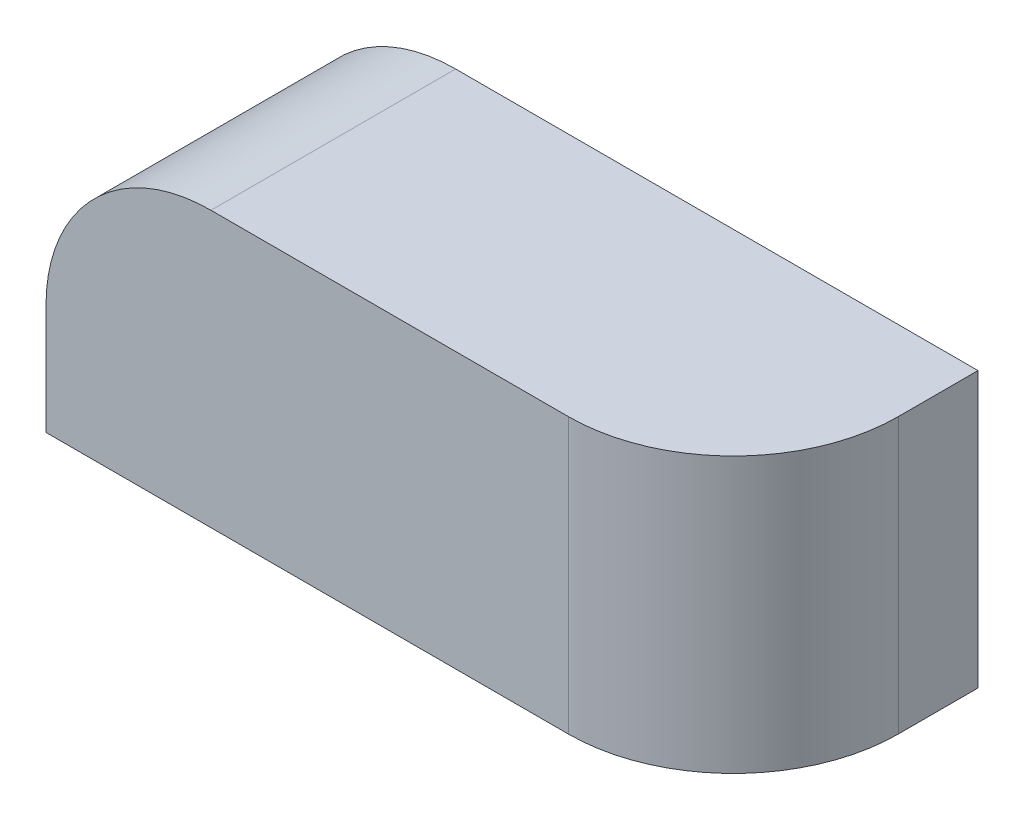
ISO-10303-21;
HEADER;
FILE_DESCRIPTION(('STEP AP214'),'2;1');
FILE_NAME('part.step','',(''),(''),'','','');
FILE_SCHEMA(('AUTOMOTIVE_DESIGN { 1 0 10303 214 1 1 1 1 }'));
ENDSEC;
DATA;
#1=APPLICATION_CONTEXT('core data for automotive mechanical design processes');
#2=APPLICATION_PROTOCOL_DEFINITION('international standard','automotive_design',2000,#1);
#3=PRODUCT_CONTEXT('',#1,'mechanical');
#4=PRODUCT('Part','Part','',(#3));
#5=PRODUCT_RELATED_PRODUCT_CATEGORY('part','',(#4));
#6=PRODUCT_DEFINITION_FORMATION('','',#4);
#7=PRODUCT_DEFINITION_CONTEXT('part definition',#1,'design');
#8=PRODUCT_DEFINITION('design','',#6,#7);
#9=PRODUCT_DEFINITION_SHAPE('','',#8);
#10=(LENGTH_UNIT() NAMED_UNIT(*) SI_UNIT(.MILLI.,.METRE.));
#11=(NAMED_UNIT(*) PLANE_ANGLE_UNIT() SI_UNIT($,.RADIAN.));
#12=(NAMED_UNIT(*) SI_UNIT($,.STERADIAN.) SOLID_ANGLE_UNIT());
#13=UNCERTAINTY_MEASURE_WITH_UNIT(LENGTH_MEASURE(1.E-05),#10,'distance_accuracy_value','');
#14=(GEOMETRIC_REPRESENTATION_CONTEXT(3) GLOBAL_UNCERTAINTY_ASSIGNED_CONTEXT((#13)) GLOBAL_UNIT_ASSIGNED_CONTEXT((#10,
#11,#12)) REPRESENTATION_CONTEXT('',''));
#15=CARTESIAN_POINT('',(0.,0.,0.));
#16=DIRECTION('',(0.,0.,1.));
#17=DIRECTION('',(1.,0.,0.));
#18=AXIS2_PLACEMENT_3D('',#15,#16,#17);
#19=CARTESIAN_POINT('',(-31.4285714285714,11.5037593984962,-89.));
#20=DIRECTION('',(0.,0.,-1.));
#21=DIRECTION('',(-1.,0.,0.));
#22=AXIS2_PLACEMENT_3D('',#19,#20,#21);
#23=PLANE('',#22);
#24=DIRECTION('',(1.,0.,0.));
#25=VECTOR('',#24,1.);
#26=CARTESIAN_POINT('',(158.571428571429,-28.4962406015038,-89.));
#27=LINE('',#26,#25);
#28=CARTESIAN_POINT('',(-91.4285714285714,-28.4962406015038,-89.));
#29=VERTEX_POINT('',#28);
#30=CARTESIAN_POINT('',(158.571428571429,-28.4962406015038,-89.));
#31=VERTEX_POINT('',#30);
#32=EDGE_CURVE('E147',#29,#31,#27,.T.);
#33=ORIENTED_EDGE('',*,*,#32,.F.);
#34=DIRECTION('',(0.,-1.,0.));
#35=VECTOR('',#34,1.);
#36=CARTESIAN_POINT('',(-91.4285714285714,-28.4962406015038,-89.));
#37=LINE('',#36,#35);
#38=CARTESIAN_POINT('',(-91.4285714285714,11.5037593984962,-89.));
#39=VERTEX_POINT('',#38);
#40=EDGE_CURVE('E133',#39,#29,#37,.T.);
#41=ORIENTED_EDGE('',*,*,#40,.F.);
#42=CARTESIAN_POINT('',(-31.4285714285714,11.5037593984962,-89.));
#43=DIRECTION('',(0.,0.,1.));
#44=DIRECTION('',(-1.,0.,0.));
#45=AXIS2_PLACEMENT_3D('',#42,#43,#44);
#46=CIRCLE('',#45,60.);
#47=CARTESIAN_POINT('',(-31.4285714285714,71.5037593984962,-89.));
#48=VERTEX_POINT('',#47);
#49=EDGE_CURVE('E161',#48,#39,#46,.T.);
#50=ORIENTED_EDGE('',*,*,#49,.F.);
#51=DIRECTION('',(-1.,0.,0.));
#52=VECTOR('',#51,1.);
#53=CARTESIAN_POINT('',(-31.4285714285714,71.5037593984962,-89.));
#54=LINE('',#53,#52);
#55=CARTESIAN_POINT('',(158.571428571429,71.5037593984962,-89.));
#56=VERTEX_POINT('',#55);
#57=EDGE_CURVE('E163',#56,#48,#54,.T.);
#58=ORIENTED_EDGE('',*,*,#57,.F.);
#59=DIRECTION('',(0.,1.,0.));
#60=VECTOR('',#59,1.);
#61=CARTESIAN_POINT('',(158.571428571429,71.5037593984962,-89.));
#62=LINE('',#61,#60);
#63=EDGE_CURVE('E149',#31,#56,#62,.T.);
#64=ORIENTED_EDGE('',*,*,#63,.F.);
#65=EDGE_LOOP('',(#33,#41,#50,#58,#64));
#66=FACE_BOUND('',#65,.T.);
#67=DIRECTION('',(0.,-1.,0.));
#68=VECTOR('',#67,1.);
#69=CARTESIAN_POINT('',(-88.2285714285714,-28.4962406015038,-89.));
#70=LINE('',#69,#68);
#71=CARTESIAN_POINT('',(-88.2285714285714,11.5037593984962,-89.));
#72=VERTEX_POINT('',#71);
#73=CARTESIAN_POINT('',(-88.2285714285714,-25.2962406015038,-89.));
#74=VERTEX_POINT('',#73);
#75=EDGE_CURVE('E222',#72,#74,#70,.T.);
#76=ORIENTED_EDGE('',*,*,#75,.T.);
#77=DIRECTION('',(1.,0.,0.));
#78=VECTOR('',#77,1.);
#79=CARTESIAN_POINT('',(158.571428571429,-25.2962406015038,-89.));
#80=LINE('',#79,#78);
#81=CARTESIAN_POINT('',(155.371428571429,-25.2962406015038,-89.));
#82=VERTEX_POINT('',#81);
#83=EDGE_CURVE('E217',#74,#82,#80,.T.);
#84=ORIENTED_EDGE('',*,*,#83,.T.);
#85=DIRECTION('',(0.,1.,0.));
#86=VECTOR('',#85,1.);
#87=CARTESIAN_POINT('',(155.371428571429,71.5037593984962,-89.));
#88=LINE('',#87,#86);
#89=CARTESIAN_POINT('',(155.371428571429,68.3037593984962,-89.));
#90=VERTEX_POINT('',#89);
#91=EDGE_CURVE('E214',#82,#90,#88,.T.);
#92=ORIENTED_EDGE('',*,*,#91,.T.);
#93=DIRECTION('',(-1.,0.,0.));
#94=VECTOR('',#93,1.);
#95=CARTESIAN_POINT('',(-31.4285714285714,68.3037593984962,-89.));
#96=LINE('',#95,#94);
#97=CARTESIAN_POINT('',(-31.4285714285714,68.3037593984962,-89.));
#98=VERTEX_POINT('',#97);
#99=EDGE_CURVE('E52',#90,#98,#96,.T.);
#100=ORIENTED_EDGE('',*,*,#99,.T.);
#101=CARTESIAN_POINT('',(-31.4285714285714,11.5037593984962,-89.));
#102=DIRECTION('',(0.,0.,-1.));
#103=DIRECTION('',(-1.,0.,0.));
#104=AXIS2_PLACEMENT_3D('',#101,#102,#103);
#105=CIRCLE('',#104,56.8);
#106=EDGE_CURVE('E219',#98,#72,#105,.F.);
#107=ORIENTED_EDGE('',*,*,#106,.T.);
#108=EDGE_LOOP('',(#76,#84,#92,#100,#107));
#109=FACE_BOUND('',#108,.T.);
#110=ADVANCED_FACE('F35',(#66,#109),#23,.T.);
#111=CARTESIAN_POINT('',(158.571428571429,-28.4962406015038,-89.));
#112=DIRECTION('',(0.,-1.,0.));
#113=DIRECTION('',(1.,0.,0.));
#114=AXIS2_PLACEMENT_3D('',#111,#112,#113);
#115=PLANE('',#114);
#116=DIRECTION('',(0.,0.,1.));
#117=VECTOR('',#116,1.);
#118=CARTESIAN_POINT('',(158.571428571429,-28.4962406015038,-89.));
#119=LINE('',#118,#117);
#120=CARTESIAN_POINT('',(158.571428571429,-28.4962406015038,-60.));
#121=VERTEX_POINT('',#120);
#122=EDGE_CURVE('E160',#31,#121,#119,.T.);
#123=ORIENTED_EDGE('',*,*,#122,.T.);
#124=CARTESIAN_POINT('',(98.5714285714286,-28.4962406015038,-60.));
#125=DIRECTION('',(0.,1.,0.));
#126=DIRECTION('',(0.,0.,1.));
#127=AXIS2_PLACEMENT_3D('',#124,#125,#126);
#128=CIRCLE('',#127,60.);
#129=CARTESIAN_POINT('',(98.5714285714286,-28.4962406015038,0.));
#130=VERTEX_POINT('',#129);
#131=EDGE_CURVE('E141',#130,#121,#128,.T.);
#132=ORIENTED_EDGE('',*,*,#131,.F.);
#133=DIRECTION('',(1.,0.,0.));
#134=VECTOR('',#133,1.);
#135=CARTESIAN_POINT('',(158.571428571429,-28.4962406015038,0.));
#136=LINE('',#135,#134);
#137=CARTESIAN_POINT('',(-91.4285714285714,-28.4962406015038,0.));
#138=VERTEX_POINT('',#137);
#139=EDGE_CURVE('E139',#138,#130,#136,.T.);
#140=ORIENTED_EDGE('',*,*,#139,.F.);
#141=DIRECTION('',(0.,0.,1.));
#142=VECTOR('',#141,1.);
#143=CARTESIAN_POINT('',(-91.4285714285714,-28.4962406015038,-89.));
#144=LINE('',#143,#142);
#145=EDGE_CURVE('E12',#29,#138,#144,.T.);
#146=ORIENTED_EDGE('',*,*,#145,.F.);
#147=ORIENTED_EDGE('',*,*,#32,.T.);
#148=EDGE_LOOP('',(#123,#132,#140,#146,#147));
#149=FACE_BOUND('',#148,.T.);
#150=ADVANCED_FACE('F37',(#149),#115,.T.);
#151=CARTESIAN_POINT('',(-31.4285714285714,71.5037593984962,-89.));
#152=DIRECTION('',(0.,1.,0.));
#153=DIRECTION('',(-1.,0.,0.));
#154=AXIS2_PLACEMENT_3D('',#151,#152,#153);
#155=PLANE('',#154);
#156=DIRECTION('',(-1.,0.,0.));
#157=VECTOR('',#156,1.);
#158=CARTESIAN_POINT('',(-31.4285714285714,71.5037593984962,0.));
#159=LINE('',#158,#157);
#160=CARTESIAN_POINT('',(98.5714285714286,71.5037593984962,0.));
#161=VERTEX_POINT('',#160);
#162=CARTESIAN_POINT('',(-31.4285714285714,71.5037593984962,0.));
#163=VERTEX_POINT('',#162);
#164=EDGE_CURVE('E143',#161,#163,#159,.T.);
#165=ORIENTED_EDGE('',*,*,#164,.F.);
#166=CARTESIAN_POINT('',(98.5714285714286,71.5037593984962,-60.));
#167=DIRECTION('',(0.,1.,0.));
#168=DIRECTION('',(0.,0.,1.));
#169=AXIS2_PLACEMENT_3D('',#166,#167,#168);
#170=CIRCLE('',#169,60.);
#171=CARTESIAN_POINT('',(158.571428571429,71.5037593984962,-60.));
#172=VERTEX_POINT('',#171);
#173=EDGE_CURVE('E39',#161,#172,#170,.T.);
#174=ORIENTED_EDGE('',*,*,#173,.T.);
#175=DIRECTION('',(0.,0.,1.));
#176=VECTOR('',#175,1.);
#177=CARTESIAN_POINT('',(158.571428571429,71.5037593984962,-89.));
#178=LINE('',#177,#176);
#179=EDGE_CURVE('E158',#56,#172,#178,.T.);
#180=ORIENTED_EDGE('',*,*,#179,.F.);
#181=ORIENTED_EDGE('',*,*,#57,.T.);
#182=DIRECTION('',(0.,0.,1.));
#183=VECTOR('',#182,1.);
#184=CARTESIAN_POINT('',(-31.4285714285714,71.5037593984962,-89.));
#185=LINE('',#184,#183);
#186=EDGE_CURVE('E155',#48,#163,#185,.T.);
#187=ORIENTED_EDGE('',*,*,#186,.T.);
#188=EDGE_LOOP('',(#165,#174,#180,#181,#187));
#189=FACE_BOUND('',#188,.T.);
#190=ADVANCED_FACE('F170',(#189),#155,.T.);
#191=CARTESIAN_POINT('',(-91.4285714285714,-28.4962406015038,-89.));
#192=DIRECTION('',(-1.,0.,0.));
#193=DIRECTION('',(0.,-1.,0.));
#194=AXIS2_PLACEMENT_3D('',#191,#192,#193);
#195=PLANE('',#194);
#196=DIRECTION('',(0.,-1.,0.));
#197=VECTOR('',#196,1.);
#198=CARTESIAN_POINT('',(-91.4285714285714,-28.4962406015038,0.));
#199=LINE('',#198,#197);
#200=CARTESIAN_POINT('',(-91.4285714285714,11.5037593984962,0.));
#201=VERTEX_POINT('',#200);
#202=EDGE_CURVE('E131',#201,#138,#199,.T.);
#203=ORIENTED_EDGE('',*,*,#202,.F.);
#204=DIRECTION('',(0.,0.,1.));
#205=VECTOR('',#204,1.);
#206=CARTESIAN_POINT('',(-91.4285714285714,11.5037593984962,-89.));
#207=LINE('',#206,#205);
#208=EDGE_CURVE('E44',#39,#201,#207,.T.);
#209=ORIENTED_EDGE('',*,*,#208,.F.);
#210=ORIENTED_EDGE('',*,*,#40,.T.);
#211=ORIENTED_EDGE('',*,*,#145,.T.);
#212=EDGE_LOOP('',(#203,#209,#210,#211));
#213=FACE_BOUND('',#212,.T.);
#214=ADVANCED_FACE('F129',(#213),#195,.T.);
#215=CARTESIAN_POINT('',(-31.4285714285714,11.5037593984962,-89.));
#216=DIRECTION('',(0.,0.,1.));
#217=DIRECTION('',(1.,0.,0.));
#218=AXIS2_PLACEMENT_3D('',#215,#216,#217);
#219=CYLINDRICAL_SURFACE('',#218,60.);
#220=CARTESIAN_POINT('',(-31.4285714285714,11.5037593984962,0.));
#221=DIRECTION('',(0.,0.,1.));
#222=DIRECTION('',(-1.,0.,0.));
#223=AXIS2_PLACEMENT_3D('',#220,#221,#222);
#224=CIRCLE('',#223,60.);
#225=EDGE_CURVE('E146',#163,#201,#224,.T.);
#226=ORIENTED_EDGE('',*,*,#225,.F.);
#227=ORIENTED_EDGE('',*,*,#186,.F.);
#228=ORIENTED_EDGE('',*,*,#49,.T.);
#229=ORIENTED_EDGE('',*,*,#208,.T.);
#230=EDGE_LOOP('',(#226,#227,#228,#229));
#231=FACE_BOUND('',#230,.T.);
#232=ADVANCED_FACE('F173',(#231),#219,.T.);
#233=CARTESIAN_POINT('',(158.571428571429,71.5037593984962,-89.));
#234=DIRECTION('',(1.,0.,0.));
#235=DIRECTION('',(0.,0.,-1.));
#236=AXIS2_PLACEMENT_3D('',#233,#234,#235);
#237=PLANE('',#236);
#238=DIRECTION('',(0.,1.,0.));
#239=VECTOR('',#238,1.);
#240=CARTESIAN_POINT('',(158.571428571429,-28.4962406015038,-60.));
#241=LINE('',#240,#239);
#242=EDGE_CURVE('E73',#121,#172,#241,.T.);
#243=ORIENTED_EDGE('',*,*,#242,.F.);
#244=ORIENTED_EDGE('',*,*,#122,.F.);
#245=ORIENTED_EDGE('',*,*,#63,.T.);
#246=ORIENTED_EDGE('',*,*,#179,.T.);
#247=EDGE_LOOP('',(#243,#244,#245,#246));
#248=FACE_BOUND('',#247,.T.);
#249=ADVANCED_FACE('F175',(#248),#237,.T.);
#250=CARTESIAN_POINT('',(-31.4285714285714,11.5037593984962,0.));
#251=DIRECTION('',(0.,0.,-1.));
#252=DIRECTION('',(-1.,0.,0.));
#253=AXIS2_PLACEMENT_3D('',#250,#251,#252);
#254=PLANE('',#253);
#255=ORIENTED_EDGE('',*,*,#139,.T.);
#256=DIRECTION('',(0.,1.,0.));
#257=VECTOR('',#256,1.);
#258=CARTESIAN_POINT('',(98.5714285714286,-28.4962406015038,0.));
#259=LINE('',#258,#257);
#260=EDGE_CURVE('E167',#130,#161,#259,.T.);
#261=ORIENTED_EDGE('',*,*,#260,.T.);
#262=ORIENTED_EDGE('',*,*,#164,.T.);
#263=ORIENTED_EDGE('',*,*,#225,.T.);
#264=ORIENTED_EDGE('',*,*,#202,.T.);
#265=EDGE_LOOP('',(#255,#261,#262,#263,#264));
#266=FACE_BOUND('',#265,.T.);
#267=ADVANCED_FACE('F145',(#266),#254,.F.);
#268=CARTESIAN_POINT('',(98.5714285714286,-28.4962406015038,-60.));
#269=DIRECTION('',(0.,1.,0.));
#270=DIRECTION('',(0.,0.,1.));
#271=AXIS2_PLACEMENT_3D('',#268,#269,#270);
#272=CYLINDRICAL_SURFACE('',#271,60.);
#273=ORIENTED_EDGE('',*,*,#260,.F.);
#274=ORIENTED_EDGE('',*,*,#131,.T.);
#275=ORIENTED_EDGE('',*,*,#242,.T.);
#276=ORIENTED_EDGE('',*,*,#173,.F.);
#277=EDGE_LOOP('',(#273,#274,#275,#276));
#278=FACE_BOUND('',#277,.T.);
#279=ADVANCED_FACE('F193',(#278),#272,.T.);
#280=CARTESIAN_POINT('',(158.571428571429,-25.2962406015038,-89.));
#281=DIRECTION('',(0.,-1.,0.));
#282=DIRECTION('',(1.,0.,0.));
#283=AXIS2_PLACEMENT_3D('',#280,#281,#282);
#284=PLANE('',#283);
#285=DIRECTION('',(0.,0.,1.));
#286=VECTOR('',#285,1.);
#287=CARTESIAN_POINT('',(155.371428571429,-25.2962406015038,-89.));
#288=LINE('',#287,#286);
#289=CARTESIAN_POINT('',(155.371428571429,-25.2962406015038,-60.));
#290=VERTEX_POINT('',#289);
#291=EDGE_CURVE('E225',#82,#290,#288,.T.);
#292=ORIENTED_EDGE('',*,*,#291,.F.);
#293=ORIENTED_EDGE('',*,*,#83,.F.);
#294=DIRECTION('',(0.,0.,1.));
#295=VECTOR('',#294,1.);
#296=CARTESIAN_POINT('',(-88.2285714285714,-25.2962406015038,-89.));
#297=LINE('',#296,#295);
#298=CARTESIAN_POINT('',(-88.2285714285714,-25.2962406015038,-3.2));
#299=VERTEX_POINT('',#298);
#300=EDGE_CURVE('E208',#74,#299,#297,.T.);
#301=ORIENTED_EDGE('',*,*,#300,.T.);
#302=DIRECTION('',(1.,0.,0.));
#303=VECTOR('',#302,1.);
#304=CARTESIAN_POINT('',(158.571428571429,-25.2962406015038,-3.19999999999999));
#305=LINE('',#304,#303);
#306=CARTESIAN_POINT('',(98.5714285714286,-25.2962406015038,-3.2));
#307=VERTEX_POINT('',#306);
#308=EDGE_CURVE('E238',#299,#307,#305,.T.);
#309=ORIENTED_EDGE('',*,*,#308,.T.);
#310=CARTESIAN_POINT('',(98.5714285714286,-25.2962406015038,-60.));
#311=DIRECTION('',(0.,-1.,0.));
#312=DIRECTION('',(1.,0.,0.));
#313=AXIS2_PLACEMENT_3D('',#310,#311,#312);
#314=CIRCLE('',#313,56.8);
#315=EDGE_CURVE('E232',#307,#290,#314,.F.);
#316=ORIENTED_EDGE('',*,*,#315,.T.);
#317=EDGE_LOOP('',(#292,#293,#301,#309,#316));
#318=FACE_BOUND('',#317,.T.);
#319=ADVANCED_FACE('F199',(#318),#284,.F.);
#320=CARTESIAN_POINT('',(-31.4285714285714,68.3037593984962,-89.));
#321=DIRECTION('',(0.,1.,0.));
#322=DIRECTION('',(-1.,0.,0.));
#323=AXIS2_PLACEMENT_3D('',#320,#321,#322);
#324=PLANE('',#323);
#325=DIRECTION('',(-1.,0.,0.));
#326=VECTOR('',#325,1.);
#327=CARTESIAN_POINT('',(-31.4285714285714,68.3037593984962,-3.19999999999999));
#328=LINE('',#327,#326);
#329=CARTESIAN_POINT('',(98.5714285714286,68.3037593984962,-3.2));
#330=VERTEX_POINT('',#329);
#331=CARTESIAN_POINT('',(-31.4285714285714,68.3037593984962,-3.19999999999999));
#332=VERTEX_POINT('',#331);
#333=EDGE_CURVE('E239',#330,#332,#328,.T.);
#334=ORIENTED_EDGE('',*,*,#333,.T.);
#335=DIRECTION('',(0.,0.,1.));
#336=VECTOR('',#335,1.);
#337=CARTESIAN_POINT('',(-31.4285714285714,68.3037593984962,-89.));
#338=LINE('',#337,#336);
#339=EDGE_CURVE('E236',#98,#332,#338,.T.);
#340=ORIENTED_EDGE('',*,*,#339,.F.);
#341=ORIENTED_EDGE('',*,*,#99,.F.);
#342=DIRECTION('',(0.,0.,1.));
#343=VECTOR('',#342,1.);
#344=CARTESIAN_POINT('',(155.371428571429,68.3037593984962,-89.));
#345=LINE('',#344,#343);
#346=CARTESIAN_POINT('',(155.371428571429,68.3037593984962,-60.));
#347=VERTEX_POINT('',#346);
#348=EDGE_CURVE('E234',#90,#347,#345,.T.);
#349=ORIENTED_EDGE('',*,*,#348,.T.);
#350=CARTESIAN_POINT('',(98.5714285714286,68.3037593984962,-60.));
#351=DIRECTION('',(0.,1.,0.));
#352=DIRECTION('',(-1.,0.,0.));
#353=AXIS2_PLACEMENT_3D('',#350,#351,#352);
#354=CIRCLE('',#353,56.8);
#355=EDGE_CURVE('E81',#330,#347,#354,.T.);
#356=ORIENTED_EDGE('',*,*,#355,.F.);
#357=EDGE_LOOP('',(#334,#340,#341,#349,#356));
#358=FACE_BOUND('',#357,.T.);
#359=ADVANCED_FACE('F203',(#358),#324,.F.);
#360=CARTESIAN_POINT('',(-88.2285714285714,-28.4962406015038,-89.));
#361=DIRECTION('',(-1.,0.,0.));
#362=DIRECTION('',(0.,-1.,0.));
#363=AXIS2_PLACEMENT_3D('',#360,#361,#362);
#364=PLANE('',#363);
#365=DIRECTION('',(0.,-1.,0.));
#366=VECTOR('',#365,1.);
#367=CARTESIAN_POINT('',(-88.2285714285714,-28.4962406015038,-3.19999999999999));
#368=LINE('',#367,#366);
#369=CARTESIAN_POINT('',(-88.2285714285714,11.5037593984962,-3.19999999999999));
#370=VERTEX_POINT('',#369);
#371=EDGE_CURVE('E228',#370,#299,#368,.T.);
#372=ORIENTED_EDGE('',*,*,#371,.T.);
#373=ORIENTED_EDGE('',*,*,#300,.F.);
#374=ORIENTED_EDGE('',*,*,#75,.F.);
#375=DIRECTION('',(0.,0.,1.));
#376=VECTOR('',#375,1.);
#377=CARTESIAN_POINT('',(-88.2285714285714,11.5037593984962,-89.));
#378=LINE('',#377,#376);
#379=EDGE_CURVE('E244',#72,#370,#378,.T.);
#380=ORIENTED_EDGE('',*,*,#379,.T.);
#381=EDGE_LOOP('',(#372,#373,#374,#380));
#382=FACE_BOUND('',#381,.T.);
#383=ADVANCED_FACE('F272',(#382),#364,.F.);
#384=CARTESIAN_POINT('',(-31.4285714285714,11.5037593984962,-89.));
#385=DIRECTION('',(0.,0.,1.));
#386=DIRECTION('',(1.,0.,0.));
#387=AXIS2_PLACEMENT_3D('',#384,#385,#386);
#388=CYLINDRICAL_SURFACE('',#387,56.8);
#389=CARTESIAN_POINT('',(-31.4285714285714,11.5037593984962,-3.19999999999999));
#390=DIRECTION('',(0.,0.,-1.));
#391=DIRECTION('',(-1.,0.,0.));
#392=AXIS2_PLACEMENT_3D('',#389,#390,#391);
#393=CIRCLE('',#392,56.8);
#394=EDGE_CURVE('E241',#332,#370,#393,.F.);
#395=ORIENTED_EDGE('',*,*,#394,.T.);
#396=ORIENTED_EDGE('',*,*,#379,.F.);
#397=ORIENTED_EDGE('',*,*,#106,.F.);
#398=ORIENTED_EDGE('',*,*,#339,.T.);
#399=EDGE_LOOP('',(#395,#396,#397,#398));
#400=FACE_BOUND('',#399,.T.);
#401=ADVANCED_FACE('F280',(#400),#388,.F.);
#402=CARTESIAN_POINT('',(155.371428571429,71.5037593984962,-89.));
#403=DIRECTION('',(1.,0.,0.));
#404=DIRECTION('',(0.,0.,-1.));
#405=AXIS2_PLACEMENT_3D('',#402,#403,#404);
#406=PLANE('',#405);
#407=DIRECTION('',(0.,1.,0.));
#408=VECTOR('',#407,1.);
#409=CARTESIAN_POINT('',(155.371428571429,-28.4962406015038,-60.));
#410=LINE('',#409,#408);
#411=EDGE_CURVE('E231',#290,#347,#410,.T.);
#412=ORIENTED_EDGE('',*,*,#411,.T.);
#413=ORIENTED_EDGE('',*,*,#348,.F.);
#414=ORIENTED_EDGE('',*,*,#91,.F.);
#415=ORIENTED_EDGE('',*,*,#291,.T.);
#416=EDGE_LOOP('',(#412,#413,#414,#415));
#417=FACE_BOUND('',#416,.T.);
#418=ADVANCED_FACE('F260',(#417),#406,.F.);
#419=CARTESIAN_POINT('',(-31.4285714285714,11.5037593984962,-3.2));
#420=DIRECTION('',(0.,0.,-1.));
#421=DIRECTION('',(-1.,0.,0.));
#422=AXIS2_PLACEMENT_3D('',#419,#420,#421);
#423=PLANE('',#422);
#424=ORIENTED_EDGE('',*,*,#308,.F.);
#425=ORIENTED_EDGE('',*,*,#371,.F.);
#426=ORIENTED_EDGE('',*,*,#394,.F.);
#427=ORIENTED_EDGE('',*,*,#333,.F.);
#428=DIRECTION('',(0.,1.,0.));
#429=VECTOR('',#428,1.);
#430=CARTESIAN_POINT('',(98.5714285714286,11.5037593984962,-3.2));
#431=LINE('',#430,#429);
#432=EDGE_CURVE('E229',#307,#330,#431,.T.);
#433=ORIENTED_EDGE('',*,*,#432,.F.);
#434=EDGE_LOOP('',(#424,#425,#426,#427,#433));
#435=FACE_BOUND('',#434,.T.);
#436=ADVANCED_FACE('F277',(#435),#423,.T.);
#437=CARTESIAN_POINT('',(98.5714285714286,-28.4962406015038,-60.));
#438=DIRECTION('',(0.,1.,0.));
#439=DIRECTION('',(0.,0.,1.));
#440=AXIS2_PLACEMENT_3D('',#437,#438,#439);
#441=CYLINDRICAL_SURFACE('',#440,56.8);
#442=ORIENTED_EDGE('',*,*,#432,.T.);
#443=ORIENTED_EDGE('',*,*,#355,.T.);
#444=ORIENTED_EDGE('',*,*,#411,.F.);
#445=ORIENTED_EDGE('',*,*,#315,.F.);
#446=EDGE_LOOP('',(#442,#443,#444,#445));
#447=FACE_BOUND('',#446,.T.);
#448=ADVANCED_FACE('F267',(#447),#441,.F.);
#449=CLOSED_SHELL('',(#110,#150,#190,#214,#232,#249,#267,#279,#319,#359,#383,#401,#418,#436,#448));
#450=MANIFOLD_SOLID_BREP('B2',#449);
#451=ADVANCED_BREP_SHAPE_REPRESENTATION('',(#18,#450),#14);
#452=SHAPE_DEFINITION_REPRESENTATION(#9,#451);
ENDSEC;
END-ISO-10303-21;
